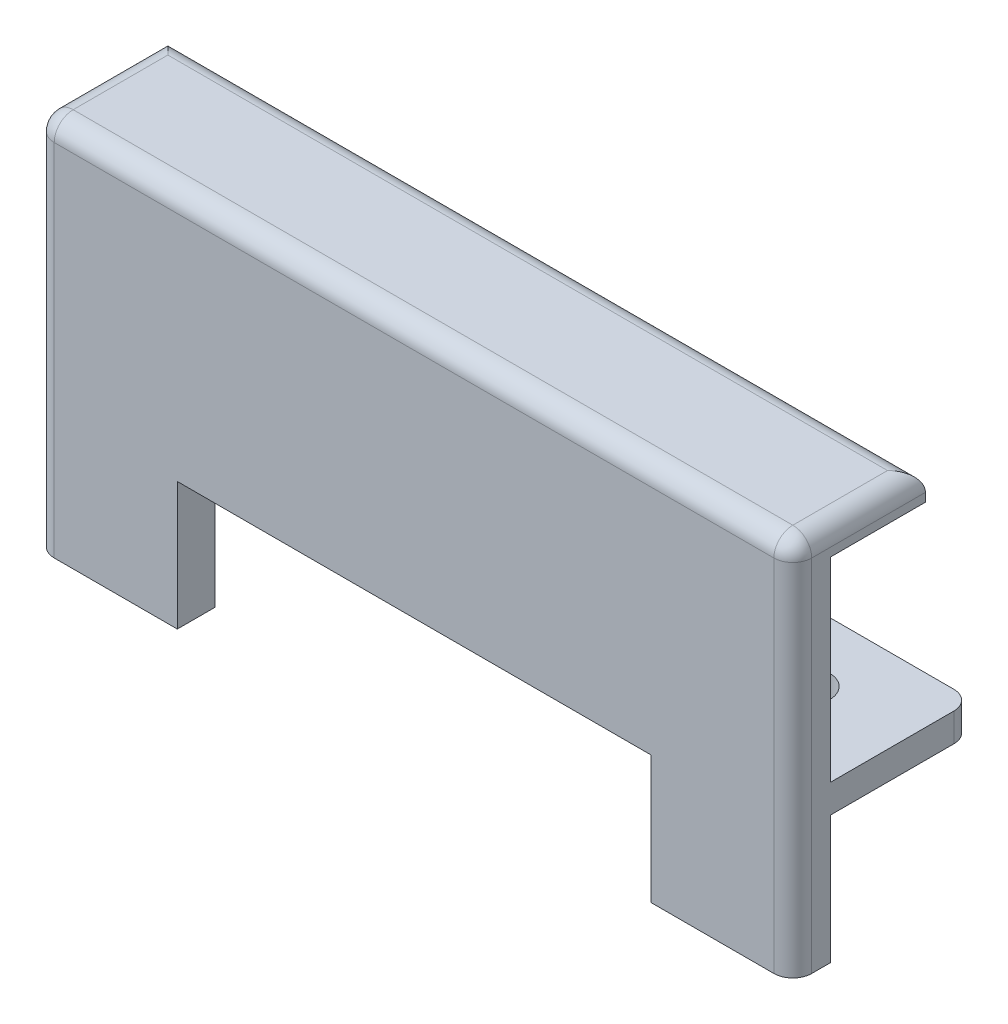
ISO-10303-21;
HEADER;
FILE_DESCRIPTION(('STEP AP214'),'2;1');
FILE_NAME('part.step','',(''),(''),'','','');
FILE_SCHEMA(('AUTOMOTIVE_DESIGN { 1 0 10303 214 1 1 1 1 }'));
ENDSEC;
DATA;
#1=APPLICATION_CONTEXT('core data for automotive mechanical design processes');
#2=APPLICATION_PROTOCOL_DEFINITION('international standard','automotive_design',2000,#1);
#3=PRODUCT_CONTEXT('',#1,'mechanical');
#4=PRODUCT('Part','Part','',(#3));
#5=PRODUCT_RELATED_PRODUCT_CATEGORY('part','',(#4));
#6=PRODUCT_DEFINITION_FORMATION('','',#4);
#7=PRODUCT_DEFINITION_CONTEXT('part definition',#1,'design');
#8=PRODUCT_DEFINITION('design','',#6,#7);
#9=PRODUCT_DEFINITION_SHAPE('','',#8);
#10=(LENGTH_UNIT() NAMED_UNIT(*) SI_UNIT(.MILLI.,.METRE.));
#11=(NAMED_UNIT(*) PLANE_ANGLE_UNIT() SI_UNIT($,.RADIAN.));
#12=(NAMED_UNIT(*) SI_UNIT($,.STERADIAN.) SOLID_ANGLE_UNIT());
#13=UNCERTAINTY_MEASURE_WITH_UNIT(LENGTH_MEASURE(1.E-05),#10,'distance_accuracy_value','');
#14=(GEOMETRIC_REPRESENTATION_CONTEXT(3) GLOBAL_UNCERTAINTY_ASSIGNED_CONTEXT((#13)) GLOBAL_UNIT_ASSIGNED_CONTEXT((#10,
#11,#12)) REPRESENTATION_CONTEXT('',''));
#15=CARTESIAN_POINT('',(0.,0.,0.));
#16=DIRECTION('',(0.,0.,1.));
#17=DIRECTION('',(1.,0.,0.));
#18=AXIS2_PLACEMENT_3D('',#15,#16,#17);
#19=CARTESIAN_POINT('',(10.,0.,-10.));
#20=DIRECTION('',(-1.,0.,0.));
#21=DIRECTION('',(0.,0.,1.));
#22=AXIS2_PLACEMENT_3D('',#19,#20,#21);
#23=PLANE('',#22);
#24=DIRECTION('',(0.,0.,1.));
#25=VECTOR('',#24,1.);
#26=CARTESIAN_POINT('',(10.,-13.5,-15.));
#27=LINE('',#26,#25);
#28=CARTESIAN_POINT('',(10.,-13.5,-13.));
#29=VERTEX_POINT('',#28);
#30=CARTESIAN_POINT('',(10.,-13.5,0.));
#31=VERTEX_POINT('',#30);
#32=EDGE_CURVE('E252',#29,#31,#27,.T.);
#33=ORIENTED_EDGE('',*,*,#32,.F.);
#34=DIRECTION('',(0.,-1.,0.));
#35=VECTOR('',#34,1.);
#36=CARTESIAN_POINT('',(10.,-10.5,-13.));
#37=LINE('',#36,#35);
#38=CARTESIAN_POINT('',(10.,-10.5,-13.));
#39=VERTEX_POINT('',#38);
#40=EDGE_CURVE('E305',#29,#39,#37,.F.);
#41=ORIENTED_EDGE('',*,*,#40,.T.);
#42=DIRECTION('',(0.,0.,-1.));
#43=VECTOR('',#42,1.);
#44=CARTESIAN_POINT('',(10.,-10.5,82.6096846622719));
#45=LINE('',#44,#43);
#46=CARTESIAN_POINT('',(10.,-10.5,0.));
#47=VERTEX_POINT('',#46);
#48=EDGE_CURVE('E182',#47,#39,#45,.T.);
#49=ORIENTED_EDGE('',*,*,#48,.F.);
#50=DIRECTION('',(0.,1.,0.));
#51=VECTOR('',#50,1.);
#52=CARTESIAN_POINT('',(10.,-27.,0.));
#53=LINE('',#52,#51);
#54=CARTESIAN_POINT('',(10.,10.1,0.));
#55=VERTEX_POINT('',#54);
#56=EDGE_CURVE('E176',#47,#55,#53,.T.);
#57=ORIENTED_EDGE('',*,*,#56,.T.);
#58=DIRECTION('',(0.,0.,-1.));
#59=VECTOR('',#58,1.);
#60=CARTESIAN_POINT('',(10.,10.1,82.6096846622719));
#61=LINE('',#60,#59);
#62=CARTESIAN_POINT('',(10.,10.1,-9.99999999999999));
#63=VERTEX_POINT('',#62);
#64=EDGE_CURVE('E180',#55,#63,#61,.T.);
#65=ORIENTED_EDGE('',*,*,#64,.T.);
#66=DIRECTION('',(0.,-1.,0.));
#67=VECTOR('',#66,1.);
#68=CARTESIAN_POINT('',(10.,0.,-10.));
#69=LINE('',#68,#67);
#70=CARTESIAN_POINT('',(10.,11.,-10.));
#71=VERTEX_POINT('',#70);
#72=EDGE_CURVE('E263',#71,#63,#69,.T.);
#73=ORIENTED_EDGE('',*,*,#72,.F.);
#74=DIRECTION('',(0.,0.,-1.));
#75=VECTOR('',#74,1.);
#76=CARTESIAN_POINT('',(10.,11.,4.));
#77=LINE('',#76,#75);
#78=CARTESIAN_POINT('',(10.,11.,2.));
#79=VERTEX_POINT('',#78);
#80=EDGE_CURVE('E303',#71,#79,#77,.F.);
#81=ORIENTED_EDGE('',*,*,#80,.T.);
#82=DIRECTION('',(0.,-1.,0.));
#83=VECTOR('',#82,1.);
#84=CARTESIAN_POINT('',(10.,-27.,2.));
#85=LINE('',#84,#83);
#86=CARTESIAN_POINT('',(10.,-27.,2.));
#87=VERTEX_POINT('',#86);
#88=EDGE_CURVE('E301',#79,#87,#85,.T.);
#89=ORIENTED_EDGE('',*,*,#88,.T.);
#90=DIRECTION('',(0.,0.,-1.));
#91=VECTOR('',#90,1.);
#92=CARTESIAN_POINT('',(10.,-27.,4.000025));
#93=LINE('',#92,#91);
#94=CARTESIAN_POINT('',(10.,-27.,0.));
#95=VERTEX_POINT('',#94);
#96=EDGE_CURVE('E226',#87,#95,#93,.T.);
#97=ORIENTED_EDGE('',*,*,#96,.T.);
#98=EDGE_CURVE('E187',#95,#31,#53,.T.);
#99=ORIENTED_EDGE('',*,*,#98,.T.);
#100=EDGE_LOOP('',(#33,#41,#49,#57,#65,#73,#81,#89,#97,#99));
#101=FACE_BOUND('',#100,.T.);
#102=ADVANCED_FACE('F39',(#101),#23,.F.);
#103=CARTESIAN_POINT('',(-70.,0.,4.));
#104=DIRECTION('',(-1.,0.,0.));
#105=DIRECTION('',(0.,0.,1.));
#106=AXIS2_PLACEMENT_3D('',#103,#104,#105);
#107=PLANE('',#106);
#108=DIRECTION('',(0.,0.,-1.));
#109=VECTOR('',#108,1.);
#110=CARTESIAN_POINT('',(-70.,-10.5,82.6096846622719));
#111=LINE('',#110,#109);
#112=CARTESIAN_POINT('',(-70.,-10.5,0.));
#113=VERTEX_POINT('',#112);
#114=CARTESIAN_POINT('',(-70.,-10.5,-13.));
#115=VERTEX_POINT('',#114);
#116=EDGE_CURVE('E212',#113,#115,#111,.T.);
#117=ORIENTED_EDGE('',*,*,#116,.T.);
#118=DIRECTION('',(0.,1.,0.));
#119=VECTOR('',#118,1.);
#120=CARTESIAN_POINT('',(-70.,0.,-13.));
#121=LINE('',#120,#119);
#122=CARTESIAN_POINT('',(-70.,-13.5,-13.));
#123=VERTEX_POINT('',#122);
#124=EDGE_CURVE('E295',#115,#123,#121,.F.);
#125=ORIENTED_EDGE('',*,*,#124,.T.);
#126=DIRECTION('',(0.,0.,1.));
#127=VECTOR('',#126,1.);
#128=CARTESIAN_POINT('',(-70.,-13.5,-15.));
#129=LINE('',#128,#127);
#130=CARTESIAN_POINT('',(-70.,-13.5,0.));
#131=VERTEX_POINT('',#130);
#132=EDGE_CURVE('E247',#123,#131,#129,.T.);
#133=ORIENTED_EDGE('',*,*,#132,.T.);
#134=DIRECTION('',(0.,1.,0.));
#135=VECTOR('',#134,1.);
#136=CARTESIAN_POINT('',(-70.,0.,0.));
#137=LINE('',#136,#135);
#138=CARTESIAN_POINT('',(-70.,-27.,0.));
#139=VERTEX_POINT('',#138);
#140=EDGE_CURVE('E270',#139,#131,#137,.T.);
#141=ORIENTED_EDGE('',*,*,#140,.F.);
#142=DIRECTION('',(0.,0.,1.));
#143=VECTOR('',#142,1.);
#144=CARTESIAN_POINT('',(-70.,-27.,-92.5742944882649));
#145=LINE('',#144,#143);
#146=CARTESIAN_POINT('',(-70.,-27.,2.));
#147=VERTEX_POINT('',#146);
#148=EDGE_CURVE('E257',#139,#147,#145,.T.);
#149=ORIENTED_EDGE('',*,*,#148,.T.);
#150=DIRECTION('',(0.,1.,0.));
#151=VECTOR('',#150,1.);
#152=CARTESIAN_POINT('',(-70.,0.,2.));
#153=LINE('',#152,#151);
#154=CARTESIAN_POINT('',(-70.,11.,2.));
#155=VERTEX_POINT('',#154);
#156=EDGE_CURVE('E291',#147,#155,#153,.T.);
#157=ORIENTED_EDGE('',*,*,#156,.T.);
#158=DIRECTION('',(0.,0.,-1.));
#159=VECTOR('',#158,1.);
#160=CARTESIAN_POINT('',(-70.,11.,4.));
#161=LINE('',#160,#159);
#162=CARTESIAN_POINT('',(-70.,11.,-10.));
#163=VERTEX_POINT('',#162);
#164=EDGE_CURVE('E293',#155,#163,#161,.T.);
#165=ORIENTED_EDGE('',*,*,#164,.T.);
#166=DIRECTION('',(0.,1.,0.));
#167=VECTOR('',#166,1.);
#168=CARTESIAN_POINT('',(-70.,0.,-10.));
#169=LINE('',#168,#167);
#170=CARTESIAN_POINT('',(-70.,10.1,-9.99999999999999));
#171=VERTEX_POINT('',#170);
#172=EDGE_CURVE('E265',#171,#163,#169,.T.);
#173=ORIENTED_EDGE('',*,*,#172,.F.);
#174=DIRECTION('',(0.,0.,-1.));
#175=VECTOR('',#174,1.);
#176=CARTESIAN_POINT('',(-70.,10.1,82.6096846622719));
#177=LINE('',#176,#175);
#178=CARTESIAN_POINT('',(-70.,10.1,0.));
#179=VERTEX_POINT('',#178);
#180=EDGE_CURVE('E216',#179,#171,#177,.T.);
#181=ORIENTED_EDGE('',*,*,#180,.F.);
#182=EDGE_CURVE('E201',#113,#179,#137,.T.);
#183=ORIENTED_EDGE('',*,*,#182,.F.);
#184=EDGE_LOOP('',(#117,#125,#133,#141,#149,#157,#165,#173,#181,#183));
#185=FACE_BOUND('',#184,.T.);
#186=ADVANCED_FACE('F357',(#185),#107,.T.);
#187=CARTESIAN_POINT('',(0.,0.,-10.));
#188=DIRECTION('',(0.,0.,1.));
#189=DIRECTION('',(1.,0.,0.));
#190=AXIS2_PLACEMENT_3D('',#187,#188,#189);
#191=PLANE('',#190);
#192=ORIENTED_EDGE('',*,*,#172,.T.);
#193=DIRECTION('',(1.,0.,0.));
#194=VECTOR('',#193,1.);
#195=CARTESIAN_POINT('',(10.,11.,-10.));
#196=LINE('',#195,#194);
#197=EDGE_CURVE('E307',#163,#71,#196,.T.);
#198=ORIENTED_EDGE('',*,*,#197,.T.);
#199=ORIENTED_EDGE('',*,*,#72,.T.);
#200=DIRECTION('',(1.,0.,0.));
#201=VECTOR('',#200,1.);
#202=CARTESIAN_POINT('',(0.,10.1,-10.));
#203=LINE('',#202,#201);
#204=EDGE_CURVE('E197',#171,#63,#203,.T.);
#205=ORIENTED_EDGE('',*,*,#204,.F.);
#206=EDGE_LOOP('',(#192,#198,#199,#205));
#207=FACE_BOUND('',#206,.T.);
#208=ADVANCED_FACE('F360',(#207),#191,.F.);
#209=CARTESIAN_POINT('',(0.,0.,4.));
#210=DIRECTION('',(0.,0.,1.));
#211=DIRECTION('',(1.,0.,0.));
#212=AXIS2_PLACEMENT_3D('',#209,#210,#211);
#213=PLANE('',#212);
#214=DIRECTION('',(1.,0.,0.));
#215=VECTOR('',#214,1.);
#216=CARTESIAN_POINT('',(0.,11.,4.));
#217=LINE('',#216,#215);
#218=CARTESIAN_POINT('',(8.,11.,4.));
#219=VERTEX_POINT('',#218);
#220=CARTESIAN_POINT('',(-68.,11.,4.));
#221=VERTEX_POINT('',#220);
#222=EDGE_CURVE('E56',#219,#221,#217,.F.);
#223=ORIENTED_EDGE('',*,*,#222,.T.);
#224=DIRECTION('',(0.,1.,0.));
#225=VECTOR('',#224,1.);
#226=CARTESIAN_POINT('',(-68.,0.,4.));
#227=LINE('',#226,#225);
#228=CARTESIAN_POINT('',(-68.,-27.,4.));
#229=VERTEX_POINT('',#228);
#230=EDGE_CURVE('E321',#221,#229,#227,.F.);
#231=ORIENTED_EDGE('',*,*,#230,.T.);
#232=DIRECTION('',(1.,0.,0.));
#233=VECTOR('',#232,1.);
#234=CARTESIAN_POINT('',(-70.,-27.,4.));
#235=LINE('',#234,#233);
#236=CARTESIAN_POINT('',(-55.,-27.,4.));
#237=VERTEX_POINT('',#236);
#238=EDGE_CURVE('E255',#229,#237,#235,.T.);
#239=ORIENTED_EDGE('',*,*,#238,.T.);
#240=DIRECTION('',(0.,-1.,0.));
#241=VECTOR('',#240,1.);
#242=CARTESIAN_POINT('',(-55.,0.,4.));
#243=LINE('',#242,#241);
#244=CARTESIAN_POINT('',(-55.,-13.5,4.));
#245=VERTEX_POINT('',#244);
#246=EDGE_CURVE('E240',#245,#237,#243,.T.);
#247=ORIENTED_EDGE('',*,*,#246,.F.);
#248=DIRECTION('',(-1.,0.,0.));
#249=VECTOR('',#248,1.);
#250=CARTESIAN_POINT('',(0.,-13.5,4.));
#251=LINE('',#250,#249);
#252=CARTESIAN_POINT('',(-5.,-13.5,4.));
#253=VERTEX_POINT('',#252);
#254=EDGE_CURVE('E278',#253,#245,#251,.T.);
#255=ORIENTED_EDGE('',*,*,#254,.F.);
#256=DIRECTION('',(0.,1.,0.));
#257=VECTOR('',#256,1.);
#258=CARTESIAN_POINT('',(-5.,0.,4.));
#259=LINE('',#258,#257);
#260=CARTESIAN_POINT('',(-5.,-27.,4.));
#261=VERTEX_POINT('',#260);
#262=EDGE_CURVE('E236',#261,#253,#259,.T.);
#263=ORIENTED_EDGE('',*,*,#262,.F.);
#264=CARTESIAN_POINT('',(8.00000000000001,-27.,4.));
#265=VERTEX_POINT('',#264);
#266=EDGE_CURVE('E254',#261,#265,#235,.T.);
#267=ORIENTED_EDGE('',*,*,#266,.T.);
#268=DIRECTION('',(0.,-1.,0.));
#269=VECTOR('',#268,1.);
#270=CARTESIAN_POINT('',(8.,13.,4.));
#271=LINE('',#270,#269);
#272=EDGE_CURVE('E61',#265,#219,#271,.F.);
#273=ORIENTED_EDGE('',*,*,#272,.T.);
#274=EDGE_LOOP('',(#223,#231,#239,#247,#255,#263,#267,#273));
#275=FACE_BOUND('',#274,.T.);
#276=ADVANCED_FACE('F397',(#275),#213,.T.);
#277=CARTESIAN_POINT('',(0.,0.,0.));
#278=DIRECTION('',(0.,0.,1.));
#279=DIRECTION('',(1.,0.,0.));
#280=AXIS2_PLACEMENT_3D('',#277,#278,#279);
#281=PLANE('',#280);
#282=DIRECTION('',(-1.,0.,0.));
#283=VECTOR('',#282,1.);
#284=CARTESIAN_POINT('',(0.,10.1,0.));
#285=LINE('',#284,#283);
#286=EDGE_CURVE('E194',#55,#179,#285,.T.);
#287=ORIENTED_EDGE('',*,*,#286,.F.);
#288=ORIENTED_EDGE('',*,*,#56,.F.);
#289=DIRECTION('',(-1.,0.,0.));
#290=VECTOR('',#289,1.);
#291=CARTESIAN_POINT('',(0.,-10.5,0.));
#292=LINE('',#291,#290);
#293=EDGE_CURVE('E211',#47,#113,#292,.T.);
#294=ORIENTED_EDGE('',*,*,#293,.T.);
#295=ORIENTED_EDGE('',*,*,#182,.T.);
#296=EDGE_LOOP('',(#287,#288,#294,#295));
#297=FACE_BOUND('',#296,.T.);
#298=ADVANCED_FACE('F200',(#297),#281,.F.);
#299=DIRECTION('',(-1.,0.,0.));
#300=VECTOR('',#299,1.);
#301=CARTESIAN_POINT('',(10.,-13.5,0.));
#302=LINE('',#301,#300);
#303=CARTESIAN_POINT('',(-55.,-13.5,0.));
#304=VERTEX_POINT('',#303);
#305=EDGE_CURVE('E243',#304,#131,#302,.T.);
#306=ORIENTED_EDGE('',*,*,#305,.F.);
#307=DIRECTION('',(0.,1.,0.));
#308=VECTOR('',#307,1.);
#309=CARTESIAN_POINT('',(-55.,-13.5,0.));
#310=LINE('',#309,#308);
#311=CARTESIAN_POINT('',(-55.,-27.,0.));
#312=VERTEX_POINT('',#311);
#313=EDGE_CURVE('E228',#312,#304,#310,.T.);
#314=ORIENTED_EDGE('',*,*,#313,.F.);
#315=DIRECTION('',(-1.,0.,0.));
#316=VECTOR('',#315,1.);
#317=CARTESIAN_POINT('',(-70.,-27.,0.));
#318=LINE('',#317,#316);
#319=EDGE_CURVE('E260',#312,#139,#318,.T.);
#320=ORIENTED_EDGE('',*,*,#319,.T.);
#321=ORIENTED_EDGE('',*,*,#140,.T.);
#322=EDGE_LOOP('',(#306,#314,#320,#321));
#323=FACE_BOUND('',#322,.T.);
#324=ADVANCED_FACE('F405',(#323),#281,.F.);
#325=CARTESIAN_POINT('',(-70.,-27.,-92.5742944882649));
#326=DIRECTION('',(0.,-1.,0.));
#327=DIRECTION('',(0.,0.,-1.));
#328=AXIS2_PLACEMENT_3D('',#325,#326,#327);
#329=PLANE('',#328);
#330=ORIENTED_EDGE('',*,*,#238,.F.);
#331=CARTESIAN_POINT('',(-68.,-27.,2.));
#332=DIRECTION('',(0.,-1.,0.));
#333=DIRECTION('',(0.,0.,-1.));
#334=AXIS2_PLACEMENT_3D('',#331,#332,#333);
#335=CIRCLE('',#334,2.);
#336=EDGE_CURVE('E48',#229,#147,#335,.T.);
#337=ORIENTED_EDGE('',*,*,#336,.T.);
#338=ORIENTED_EDGE('',*,*,#148,.F.);
#339=ORIENTED_EDGE('',*,*,#319,.F.);
#340=DIRECTION('',(0.,0.,-1.));
#341=VECTOR('',#340,1.);
#342=CARTESIAN_POINT('',(-55.,-27.,-92.5742944882649));
#343=LINE('',#342,#341);
#344=EDGE_CURVE('E276',#237,#312,#343,.T.);
#345=ORIENTED_EDGE('',*,*,#344,.F.);
#346=EDGE_LOOP('',(#330,#337,#338,#339,#345));
#347=FACE_BOUND('',#346,.T.);
#348=ADVANCED_FACE('F403',(#347),#329,.T.);
#349=CARTESIAN_POINT('',(-5.,-13.5,0.));
#350=VERTEX_POINT('',#349);
#351=EDGE_CURVE('E248',#31,#350,#302,.T.);
#352=ORIENTED_EDGE('',*,*,#351,.F.);
#353=ORIENTED_EDGE('',*,*,#98,.F.);
#354=CARTESIAN_POINT('',(-5.,-27.,0.));
#355=VERTEX_POINT('',#354);
#356=EDGE_CURVE('E261',#95,#355,#318,.T.);
#357=ORIENTED_EDGE('',*,*,#356,.T.);
#358=DIRECTION('',(0.,-1.,0.));
#359=VECTOR('',#358,1.);
#360=CARTESIAN_POINT('',(-5.,-13.5,0.));
#361=LINE('',#360,#359);
#362=EDGE_CURVE('E230',#350,#355,#361,.T.);
#363=ORIENTED_EDGE('',*,*,#362,.F.);
#364=EDGE_LOOP('',(#352,#353,#357,#363));
#365=FACE_BOUND('',#364,.T.);
#366=ADVANCED_FACE('F400',(#365),#281,.F.);
#367=CARTESIAN_POINT('',(0.,13.,4.));
#368=DIRECTION('',(0.,1.,0.));
#369=DIRECTION('',(0.,0.,1.));
#370=AXIS2_PLACEMENT_3D('',#367,#368,#369);
#371=PLANE('',#370);
#372=DIRECTION('',(0.,0.,-1.));
#373=VECTOR('',#372,1.);
#374=CARTESIAN_POINT('',(8.,13.,-10.));
#375=LINE('',#374,#373);
#376=CARTESIAN_POINT('',(8.,13.,2.));
#377=VERTEX_POINT('',#376);
#378=CARTESIAN_POINT('',(8.,13.,-8.));
#379=VERTEX_POINT('',#378);
#380=EDGE_CURVE('E312',#377,#379,#375,.T.);
#381=ORIENTED_EDGE('',*,*,#380,.T.);
#382=DIRECTION('',(1.,0.,0.));
#383=VECTOR('',#382,1.);
#384=CARTESIAN_POINT('',(-70.,13.,-8.));
#385=LINE('',#384,#383);
#386=CARTESIAN_POINT('',(-68.,13.,-8.));
#387=VERTEX_POINT('',#386);
#388=EDGE_CURVE('E316',#379,#387,#385,.F.);
#389=ORIENTED_EDGE('',*,*,#388,.T.);
#390=DIRECTION('',(0.,0.,-1.));
#391=VECTOR('',#390,1.);
#392=CARTESIAN_POINT('',(-68.,13.,4.));
#393=LINE('',#392,#391);
#394=CARTESIAN_POINT('',(-68.,13.,2.));
#395=VERTEX_POINT('',#394);
#396=EDGE_CURVE('E314',#387,#395,#393,.F.);
#397=ORIENTED_EDGE('',*,*,#396,.T.);
#398=DIRECTION('',(1.,0.,0.));
#399=VECTOR('',#398,1.);
#400=CARTESIAN_POINT('',(0.,13.,2.));
#401=LINE('',#400,#399);
#402=EDGE_CURVE('E310',#395,#377,#401,.T.);
#403=ORIENTED_EDGE('',*,*,#402,.T.);
#404=EDGE_LOOP('',(#381,#389,#397,#403));
#405=FACE_BOUND('',#404,.T.);
#406=ADVANCED_FACE('F378',(#405),#371,.T.);
#407=ORIENTED_EDGE('',*,*,#96,.F.);
#408=CARTESIAN_POINT('',(8.,-27.,2.));
#409=DIRECTION('',(0.,-1.,0.));
#410=DIRECTION('',(0.,0.,-1.));
#411=AXIS2_PLACEMENT_3D('',#408,#409,#410);
#412=CIRCLE('',#411,2.);
#413=EDGE_CURVE('E11',#87,#265,#412,.T.);
#414=ORIENTED_EDGE('',*,*,#413,.T.);
#415=ORIENTED_EDGE('',*,*,#266,.F.);
#416=DIRECTION('',(0.,0.,1.));
#417=VECTOR('',#416,1.);
#418=CARTESIAN_POINT('',(-5.,-27.,-92.5742944882649));
#419=LINE('',#418,#417);
#420=EDGE_CURVE('E274',#355,#261,#419,.T.);
#421=ORIENTED_EDGE('',*,*,#420,.F.);
#422=ORIENTED_EDGE('',*,*,#356,.F.);
#423=EDGE_LOOP('',(#407,#414,#415,#421,#422));
#424=FACE_BOUND('',#423,.T.);
#425=ADVANCED_FACE('F407',(#424),#329,.T.);
#426=CARTESIAN_POINT('',(10.,-13.5,-15.));
#427=DIRECTION('',(0.,1.,0.));
#428=DIRECTION('',(0.,0.,1.));
#429=AXIS2_PLACEMENT_3D('',#426,#427,#428);
#430=PLANE('',#429);
#431=CARTESIAN_POINT('',(-60.,-13.5,-7.5));
#432=DIRECTION('',(0.,-1.,0.));
#433=DIRECTION('',(0.,0.,1.));
#434=AXIS2_PLACEMENT_3D('',#431,#432,#433);
#435=CIRCLE('',#434,2.40000000000001);
#436=CARTESIAN_POINT('',(-60.,-13.5,-5.09999999999999));
#437=VERTEX_POINT('',#436);
#438=EDGE_CURVE('E220',#437,#437,#435,.T.);
#439=ORIENTED_EDGE('',*,*,#438,.F.);
#440=EDGE_LOOP('',(#439));
#441=FACE_BOUND('',#440,.T.);
#442=CARTESIAN_POINT('',(0.,-13.5,-7.49999999999999));
#443=DIRECTION('',(0.,-1.,0.));
#444=DIRECTION('',(0.,0.,-1.));
#445=AXIS2_PLACEMENT_3D('',#442,#443,#444);
#446=CIRCLE('',#445,2.4);
#447=CARTESIAN_POINT('',(0.,-13.5,-9.89999999999999));
#448=VERTEX_POINT('',#447);
#449=EDGE_CURVE('E188',#448,#448,#446,.T.);
#450=ORIENTED_EDGE('',*,*,#449,.F.);
#451=EDGE_LOOP('',(#450));
#452=FACE_BOUND('',#451,.T.);
#453=ORIENTED_EDGE('',*,*,#132,.F.);
#454=CARTESIAN_POINT('',(-68.,-13.5,-13.));
#455=DIRECTION('',(0.,1.,0.));
#456=DIRECTION('',(0.,0.,1.));
#457=AXIS2_PLACEMENT_3D('',#454,#455,#456);
#458=CIRCLE('',#457,2.);
#459=CARTESIAN_POINT('',(-68.,-13.5,-15.));
#460=VERTEX_POINT('',#459);
#461=EDGE_CURVE('E299',#123,#460,#458,.F.);
#462=ORIENTED_EDGE('',*,*,#461,.T.);
#463=DIRECTION('',(-1.,0.,0.));
#464=VECTOR('',#463,1.);
#465=CARTESIAN_POINT('',(10.,-13.5,-15.));
#466=LINE('',#465,#464);
#467=CARTESIAN_POINT('',(8.,-13.5,-15.));
#468=VERTEX_POINT('',#467);
#469=EDGE_CURVE('E244',#468,#460,#466,.T.);
#470=ORIENTED_EDGE('',*,*,#469,.F.);
#471=CARTESIAN_POINT('',(8.,-13.5,-13.));
#472=DIRECTION('',(0.,1.,0.));
#473=DIRECTION('',(0.,0.,1.));
#474=AXIS2_PLACEMENT_3D('',#471,#472,#473);
#475=CIRCLE('',#474,2.);
#476=EDGE_CURVE('E297',#468,#29,#475,.F.);
#477=ORIENTED_EDGE('',*,*,#476,.T.);
#478=ORIENTED_EDGE('',*,*,#32,.T.);
#479=ORIENTED_EDGE('',*,*,#351,.T.);
#480=DIRECTION('',(0.,0.,-1.));
#481=VECTOR('',#480,1.);
#482=CARTESIAN_POINT('',(-5.,-13.5,4.000025));
#483=LINE('',#482,#481);
#484=EDGE_CURVE('E234',#253,#350,#483,.T.);
#485=ORIENTED_EDGE('',*,*,#484,.F.);
#486=ORIENTED_EDGE('',*,*,#254,.T.);
#487=DIRECTION('',(0.,0.,-1.));
#488=VECTOR('',#487,1.);
#489=CARTESIAN_POINT('',(-55.,-13.5,4.000025));
#490=LINE('',#489,#488);
#491=EDGE_CURVE('E233',#245,#304,#490,.T.);
#492=ORIENTED_EDGE('',*,*,#491,.T.);
#493=ORIENTED_EDGE('',*,*,#305,.T.);
#494=EDGE_LOOP('',(#453,#462,#470,#477,#478,#479,#485,#486,#492,#493));
#495=FACE_BOUND('',#494,.T.);
#496=ADVANCED_FACE('F437',(#441,#452,#495),#430,.F.);
#497=CARTESIAN_POINT('',(0.,0.,-15.));
#498=DIRECTION('',(0.,0.,-1.));
#499=DIRECTION('',(-1.,0.,0.));
#500=AXIS2_PLACEMENT_3D('',#497,#498,#499);
#501=PLANE('',#500);
#502=ORIENTED_EDGE('',*,*,#469,.T.);
#503=DIRECTION('',(0.,1.,0.));
#504=VECTOR('',#503,1.);
#505=CARTESIAN_POINT('',(-68.,0.,-15.));
#506=LINE('',#505,#504);
#507=CARTESIAN_POINT('',(-68.,-10.5,-15.));
#508=VERTEX_POINT('',#507);
#509=EDGE_CURVE('E284',#460,#508,#506,.T.);
#510=ORIENTED_EDGE('',*,*,#509,.T.);
#511=DIRECTION('',(-1.,0.,0.));
#512=VECTOR('',#511,1.);
#513=CARTESIAN_POINT('',(0.,-10.5,-15.));
#514=LINE('',#513,#512);
#515=CARTESIAN_POINT('',(8.,-10.5,-15.));
#516=VERTEX_POINT('',#515);
#517=EDGE_CURVE('E198',#516,#508,#514,.T.);
#518=ORIENTED_EDGE('',*,*,#517,.F.);
#519=DIRECTION('',(0.,-1.,0.));
#520=VECTOR('',#519,1.);
#521=CARTESIAN_POINT('',(8.,-13.5,-15.));
#522=LINE('',#521,#520);
#523=EDGE_CURVE('E281',#516,#468,#522,.T.);
#524=ORIENTED_EDGE('',*,*,#523,.T.);
#525=EDGE_LOOP('',(#502,#510,#518,#524));
#526=FACE_BOUND('',#525,.T.);
#527=ADVANCED_FACE('F427',(#526),#501,.T.);
#528=CARTESIAN_POINT('',(-55.,-13.5,4.000025));
#529=DIRECTION('',(-1.,0.,0.));
#530=DIRECTION('',(0.,-1.,0.));
#531=AXIS2_PLACEMENT_3D('',#528,#529,#530);
#532=PLANE('',#531);
#533=ORIENTED_EDGE('',*,*,#246,.T.);
#534=ORIENTED_EDGE('',*,*,#344,.T.);
#535=ORIENTED_EDGE('',*,*,#313,.T.);
#536=ORIENTED_EDGE('',*,*,#491,.F.);
#537=EDGE_LOOP('',(#533,#534,#535,#536));
#538=FACE_BOUND('',#537,.T.);
#539=ADVANCED_FACE('F452',(#538),#532,.F.);
#540=CARTESIAN_POINT('',(-5.,-13.5,4.000025));
#541=DIRECTION('',(1.,0.,0.));
#542=DIRECTION('',(0.,1.,0.));
#543=AXIS2_PLACEMENT_3D('',#540,#541,#542);
#544=PLANE('',#543);
#545=ORIENTED_EDGE('',*,*,#262,.T.);
#546=ORIENTED_EDGE('',*,*,#484,.T.);
#547=ORIENTED_EDGE('',*,*,#362,.T.);
#548=ORIENTED_EDGE('',*,*,#420,.T.);
#549=EDGE_LOOP('',(#545,#546,#547,#548));
#550=FACE_BOUND('',#549,.T.);
#551=ADVANCED_FACE('F454',(#550),#544,.F.);
#552=CARTESIAN_POINT('',(0.,72.001,-7.49999999999999));
#553=DIRECTION('',(0.,-1.,0.));
#554=DIRECTION('',(0.,0.,-1.));
#555=AXIS2_PLACEMENT_3D('',#552,#553,#554);
#556=CYLINDRICAL_SURFACE('',#555,2.4);
#557=CARTESIAN_POINT('',(0.,-10.5,-7.49999999999999));
#558=DIRECTION('',(0.,-1.,0.));
#559=DIRECTION('',(1.,0.,0.));
#560=AXIS2_PLACEMENT_3D('',#557,#558,#559);
#561=CIRCLE('',#560,2.4);
#562=CARTESIAN_POINT('',(2.4,-10.5,-7.49999999999999));
#563=VERTEX_POINT('',#562);
#564=EDGE_CURVE('E205',#563,#563,#561,.F.);
#565=ORIENTED_EDGE('',*,*,#564,.T.);
#566=EDGE_LOOP('',(#565));
#567=FACE_BOUND('',#566,.T.);
#568=ORIENTED_EDGE('',*,*,#449,.T.);
#569=EDGE_LOOP('',(#568));
#570=FACE_BOUND('',#569,.T.);
#571=ADVANCED_FACE('F460',(#567,#570),#556,.F.);
#572=CARTESIAN_POINT('',(-60.,72.001,-7.5));
#573=DIRECTION('',(0.,-1.,0.));
#574=DIRECTION('',(0.,0.,-1.));
#575=AXIS2_PLACEMENT_3D('',#572,#573,#574);
#576=CYLINDRICAL_SURFACE('',#575,2.40000000000001);
#577=CARTESIAN_POINT('',(-60.,-10.5,-7.5));
#578=DIRECTION('',(0.,-1.,0.));
#579=DIRECTION('',(1.,0.,0.));
#580=AXIS2_PLACEMENT_3D('',#577,#578,#579);
#581=CIRCLE('',#580,2.40000000000001);
#582=CARTESIAN_POINT('',(-57.6,-10.5,-7.5));
#583=VERTEX_POINT('',#582);
#584=EDGE_CURVE('E202',#583,#583,#581,.F.);
#585=ORIENTED_EDGE('',*,*,#584,.T.);
#586=EDGE_LOOP('',(#585));
#587=FACE_BOUND('',#586,.T.);
#588=ORIENTED_EDGE('',*,*,#438,.T.);
#589=EDGE_LOOP('',(#588));
#590=FACE_BOUND('',#589,.T.);
#591=ADVANCED_FACE('F519',(#587,#590),#576,.F.);
#592=CARTESIAN_POINT('',(0.,-10.5,82.6096846622719));
#593=DIRECTION('',(0.,-1.,0.));
#594=DIRECTION('',(1.,0.,0.));
#595=AXIS2_PLACEMENT_3D('',#592,#593,#594);
#596=PLANE('',#595);
#597=ORIENTED_EDGE('',*,*,#584,.F.);
#598=EDGE_LOOP('',(#597));
#599=FACE_BOUND('',#598,.T.);
#600=ORIENTED_EDGE('',*,*,#517,.T.);
#601=CARTESIAN_POINT('',(-68.,-10.5,-13.));
#602=DIRECTION('',(0.,-1.,0.));
#603=DIRECTION('',(1.,0.,0.));
#604=AXIS2_PLACEMENT_3D('',#601,#602,#603);
#605=CIRCLE('',#604,2.);
#606=EDGE_CURVE('E289',#508,#115,#605,.F.);
#607=ORIENTED_EDGE('',*,*,#606,.T.);
#608=ORIENTED_EDGE('',*,*,#116,.F.);
#609=ORIENTED_EDGE('',*,*,#293,.F.);
#610=ORIENTED_EDGE('',*,*,#48,.T.);
#611=CARTESIAN_POINT('',(8.,-10.5,-13.));
#612=DIRECTION('',(0.,-1.,0.));
#613=DIRECTION('',(1.,0.,0.));
#614=AXIS2_PLACEMENT_3D('',#611,#612,#613);
#615=CIRCLE('',#614,2.);
#616=EDGE_CURVE('E287',#39,#516,#615,.F.);
#617=ORIENTED_EDGE('',*,*,#616,.T.);
#618=EDGE_LOOP('',(#600,#607,#608,#609,#610,#617));
#619=FACE_BOUND('',#618,.T.);
#620=ORIENTED_EDGE('',*,*,#564,.F.);
#621=EDGE_LOOP('',(#620));
#622=FACE_BOUND('',#621,.T.);
#623=ADVANCED_FACE('F424',(#599,#619,#622),#596,.F.);
#624=CARTESIAN_POINT('',(0.,10.1,82.6096846622719));
#625=DIRECTION('',(0.,-1.,0.));
#626=DIRECTION('',(0.,0.,-1.));
#627=AXIS2_PLACEMENT_3D('',#624,#625,#626);
#628=PLANE('',#627);
#629=ORIENTED_EDGE('',*,*,#204,.T.);
#630=ORIENTED_EDGE('',*,*,#64,.F.);
#631=ORIENTED_EDGE('',*,*,#286,.T.);
#632=ORIENTED_EDGE('',*,*,#180,.T.);
#633=EDGE_LOOP('',(#629,#630,#631,#632));
#634=FACE_BOUND('',#633,.T.);
#635=ADVANCED_FACE('F193',(#634),#628,.T.);
#636=CARTESIAN_POINT('',(-68.,0.,-13.));
#637=DIRECTION('',(0.,1.,0.));
#638=DIRECTION('',(0.,0.,1.));
#639=AXIS2_PLACEMENT_3D('',#636,#637,#638);
#640=CYLINDRICAL_SURFACE('',#639,2.);
#641=ORIENTED_EDGE('',*,*,#461,.F.);
#642=ORIENTED_EDGE('',*,*,#124,.F.);
#643=ORIENTED_EDGE('',*,*,#606,.F.);
#644=ORIENTED_EDGE('',*,*,#509,.F.);
#645=EDGE_LOOP('',(#641,#642,#643,#644));
#646=FACE_BOUND('',#645,.T.);
#647=ADVANCED_FACE('F409',(#646),#640,.T.);
#648=CARTESIAN_POINT('',(8.,0.,-13.));
#649=DIRECTION('',(0.,1.,0.));
#650=DIRECTION('',(0.,0.,1.));
#651=AXIS2_PLACEMENT_3D('',#648,#649,#650);
#652=CYLINDRICAL_SURFACE('',#651,2.);
#653=ORIENTED_EDGE('',*,*,#616,.F.);
#654=ORIENTED_EDGE('',*,*,#40,.F.);
#655=ORIENTED_EDGE('',*,*,#476,.F.);
#656=ORIENTED_EDGE('',*,*,#523,.F.);
#657=EDGE_LOOP('',(#653,#654,#655,#656));
#658=FACE_BOUND('',#657,.T.);
#659=ADVANCED_FACE('F411',(#658),#652,.T.);
#660=CARTESIAN_POINT('',(-68.,0.,2.));
#661=DIRECTION('',(0.,1.,0.));
#662=DIRECTION('',(0.,0.,1.));
#663=AXIS2_PLACEMENT_3D('',#660,#661,#662);
#664=CYLINDRICAL_SURFACE('',#663,2.);
#665=ORIENTED_EDGE('',*,*,#336,.F.);
#666=ORIENTED_EDGE('',*,*,#230,.F.);
#667=CARTESIAN_POINT('',(-68.,11.,2.));
#668=DIRECTION('',(0.,1.,0.));
#669=DIRECTION('',(0.,0.,1.));
#670=AXIS2_PLACEMENT_3D('',#667,#668,#669);
#671=CIRCLE('',#670,2.);
#672=EDGE_CURVE('E339',#155,#221,#671,.T.);
#673=ORIENTED_EDGE('',*,*,#672,.F.);
#674=ORIENTED_EDGE('',*,*,#156,.F.);
#675=EDGE_LOOP('',(#665,#666,#673,#674));
#676=FACE_BOUND('',#675,.T.);
#677=ADVANCED_FACE('F41',(#676),#664,.T.);
#678=CARTESIAN_POINT('',(8.,0.,2.));
#679=DIRECTION('',(0.,1.,0.));
#680=DIRECTION('',(0.,0.,1.));
#681=AXIS2_PLACEMENT_3D('',#678,#679,#680);
#682=CYLINDRICAL_SURFACE('',#681,2.);
#683=ORIENTED_EDGE('',*,*,#413,.F.);
#684=ORIENTED_EDGE('',*,*,#88,.F.);
#685=CARTESIAN_POINT('',(8.,11.,2.));
#686=DIRECTION('',(0.,1.,0.));
#687=DIRECTION('',(0.,0.,1.));
#688=AXIS2_PLACEMENT_3D('',#685,#686,#687);
#689=CIRCLE('',#688,2.);
#690=EDGE_CURVE('E337',#219,#79,#689,.T.);
#691=ORIENTED_EDGE('',*,*,#690,.F.);
#692=ORIENTED_EDGE('',*,*,#272,.F.);
#693=EDGE_LOOP('',(#683,#684,#691,#692));
#694=FACE_BOUND('',#693,.T.);
#695=ADVANCED_FACE('F369',(#694),#682,.T.);
#696=CARTESIAN_POINT('',(0.,11.,2.));
#697=DIRECTION('',(1.,0.,0.));
#698=DIRECTION('',(0.,0.,-1.));
#699=AXIS2_PLACEMENT_3D('',#696,#697,#698);
#700=CYLINDRICAL_SURFACE('',#699,2.);
#701=CARTESIAN_POINT('',(-68.,11.,2.));
#702=DIRECTION('',(-1.,0.,0.));
#703=DIRECTION('',(0.,0.,1.));
#704=AXIS2_PLACEMENT_3D('',#701,#702,#703);
#705=CIRCLE('',#704,2.);
#706=EDGE_CURVE('E43',#221,#395,#705,.T.);
#707=ORIENTED_EDGE('',*,*,#706,.F.);
#708=ORIENTED_EDGE('',*,*,#222,.F.);
#709=CARTESIAN_POINT('',(8.,11.,2.));
#710=DIRECTION('',(1.,0.,0.));
#711=DIRECTION('',(0.,0.,-1.));
#712=AXIS2_PLACEMENT_3D('',#709,#710,#711);
#713=CIRCLE('',#712,2.);
#714=EDGE_CURVE('E334',#377,#219,#713,.T.);
#715=ORIENTED_EDGE('',*,*,#714,.F.);
#716=ORIENTED_EDGE('',*,*,#402,.F.);
#717=EDGE_LOOP('',(#707,#708,#715,#716));
#718=FACE_BOUND('',#717,.T.);
#719=ADVANCED_FACE('F648',(#718),#700,.T.);
#720=CARTESIAN_POINT('',(-68.,11.,2.));
#721=DIRECTION('',(0.,0.,1.));
#722=DIRECTION('',(1.,0.,0.));
#723=AXIS2_PLACEMENT_3D('',#720,#721,#722);
#724=SPHERICAL_SURFACE('',#723,2.);
#725=ORIENTED_EDGE('',*,*,#672,.T.);
#726=ORIENTED_EDGE('',*,*,#706,.T.);
#727=CARTESIAN_POINT('',(-68.,11.,2.));
#728=DIRECTION('',(0.,0.,1.));
#729=DIRECTION('',(1.,0.,0.));
#730=AXIS2_PLACEMENT_3D('',#727,#728,#729);
#731=CIRCLE('',#730,2.);
#732=EDGE_CURVE('E331',#155,#395,#731,.F.);
#733=ORIENTED_EDGE('',*,*,#732,.F.);
#734=EDGE_LOOP('',(#725,#726,#733));
#735=FACE_BOUND('',#734,.T.);
#736=ADVANCED_FACE('F346',(#735),#724,.T.);
#737=CARTESIAN_POINT('',(8.,11.,2.));
#738=DIRECTION('',(0.,0.,1.));
#739=DIRECTION('',(1.,0.,0.));
#740=AXIS2_PLACEMENT_3D('',#737,#738,#739);
#741=SPHERICAL_SURFACE('',#740,2.);
#742=ORIENTED_EDGE('',*,*,#714,.T.);
#743=ORIENTED_EDGE('',*,*,#690,.T.);
#744=CARTESIAN_POINT('',(8.,11.,2.));
#745=DIRECTION('',(0.,0.,1.));
#746=DIRECTION('',(1.,0.,0.));
#747=AXIS2_PLACEMENT_3D('',#744,#745,#746);
#748=CIRCLE('',#747,2.);
#749=EDGE_CURVE('E328',#377,#79,#748,.F.);
#750=ORIENTED_EDGE('',*,*,#749,.F.);
#751=EDGE_LOOP('',(#742,#743,#750));
#752=FACE_BOUND('',#751,.T.);
#753=ADVANCED_FACE('F372',(#752),#741,.T.);
#754=CARTESIAN_POINT('',(-68.,11.,4.));
#755=DIRECTION('',(0.,0.,-1.));
#756=DIRECTION('',(-1.,0.,0.));
#757=AXIS2_PLACEMENT_3D('',#754,#755,#756);
#758=CYLINDRICAL_SURFACE('',#757,2.);
#759=ORIENTED_EDGE('',*,*,#732,.T.);
#760=ORIENTED_EDGE('',*,*,#396,.F.);
#761=CARTESIAN_POINT('',(-68.,11.,-8.));
#762=DIRECTION('',(0.707106781186547,0.,-0.707106781186547));
#763=DIRECTION('',(-0.707106781186547,0.,-0.707106781186547));
#764=AXIS2_PLACEMENT_3D('',#761,#762,#763);
#765=ELLIPSE('',#764,2.82842712474619,2.);
#766=EDGE_CURVE('E326',#163,#387,#765,.T.);
#767=ORIENTED_EDGE('',*,*,#766,.F.);
#768=ORIENTED_EDGE('',*,*,#164,.F.);
#769=EDGE_LOOP('',(#759,#760,#767,#768));
#770=FACE_BOUND('',#769,.T.);
#771=ADVANCED_FACE('F352',(#770),#758,.T.);
#772=CARTESIAN_POINT('',(8.,11.,4.));
#773=DIRECTION('',(0.,0.,1.));
#774=DIRECTION('',(1.,0.,0.));
#775=AXIS2_PLACEMENT_3D('',#772,#773,#774);
#776=CYLINDRICAL_SURFACE('',#775,2.);
#777=ORIENTED_EDGE('',*,*,#749,.T.);
#778=ORIENTED_EDGE('',*,*,#80,.F.);
#779=CARTESIAN_POINT('',(8.,11.,-8.));
#780=DIRECTION('',(0.707106781186547,0.,0.707106781186547));
#781=DIRECTION('',(-0.707106781186547,0.,0.707106781186547));
#782=AXIS2_PLACEMENT_3D('',#779,#780,#781);
#783=ELLIPSE('',#782,2.82842712474619,2.);
#784=EDGE_CURVE('E324',#379,#71,#783,.F.);
#785=ORIENTED_EDGE('',*,*,#784,.F.);
#786=ORIENTED_EDGE('',*,*,#380,.F.);
#787=EDGE_LOOP('',(#777,#778,#785,#786));
#788=FACE_BOUND('',#787,.T.);
#789=ADVANCED_FACE('F375',(#788),#776,.T.);
#790=CARTESIAN_POINT('',(0.,11.,-8.));
#791=DIRECTION('',(-1.,0.,0.));
#792=DIRECTION('',(0.,0.,1.));
#793=AXIS2_PLACEMENT_3D('',#790,#791,#792);
#794=CYLINDRICAL_SURFACE('',#793,2.);
#795=ORIENTED_EDGE('',*,*,#766,.T.);
#796=ORIENTED_EDGE('',*,*,#388,.F.);
#797=ORIENTED_EDGE('',*,*,#784,.T.);
#798=ORIENTED_EDGE('',*,*,#197,.F.);
#799=EDGE_LOOP('',(#795,#796,#797,#798));
#800=FACE_BOUND('',#799,.T.);
#801=ADVANCED_FACE('F380',(#800),#794,.T.);
#802=CLOSED_SHELL('',(#102,#186,#208,#276,#298,#324,#348,#366,#406,#425,#496,#527,#539,#551,
#571,#591,#623,#635,#647,#659,#677,#695,#719,#736,#753,#771,#789,#801));
#803=MANIFOLD_SOLID_BREP('B2',#802);
#804=ADVANCED_BREP_SHAPE_REPRESENTATION('',(#18,#803),#14);
#805=SHAPE_DEFINITION_REPRESENTATION(#9,#804);
ENDSEC;
END-ISO-10303-21;
